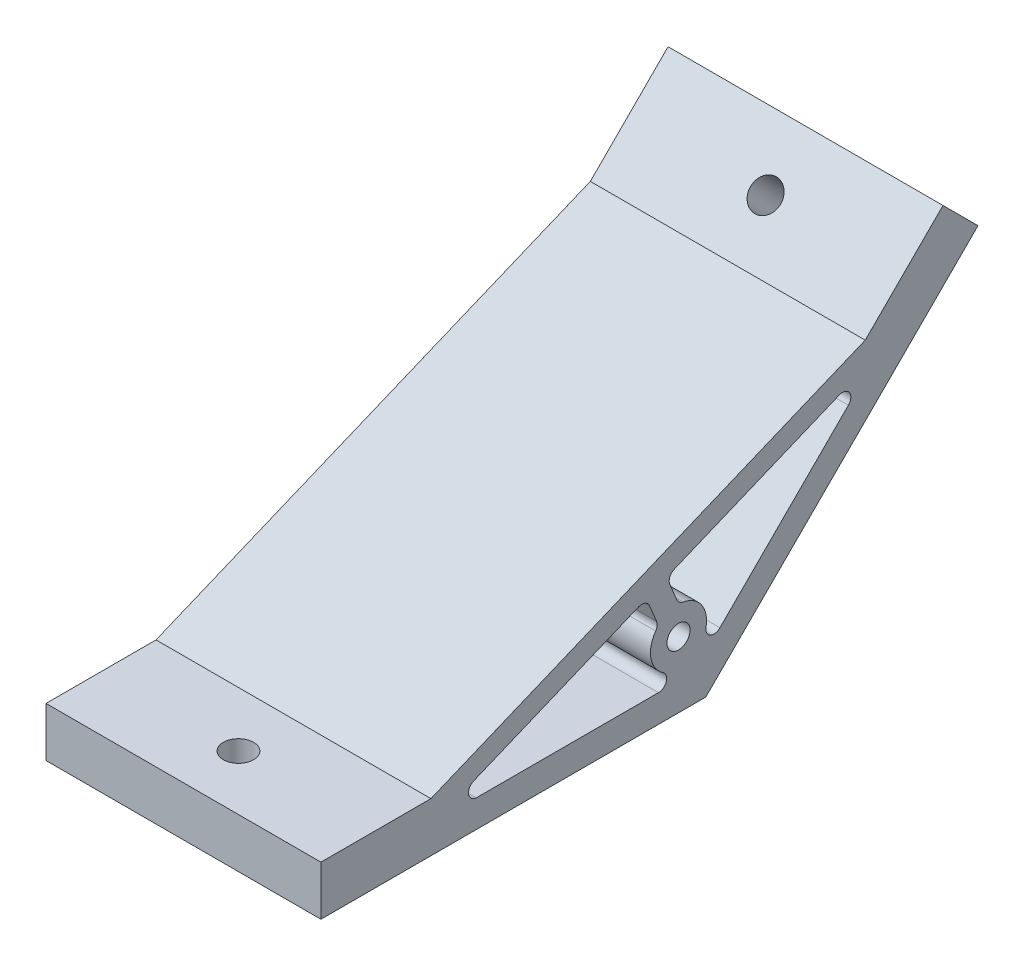
ISO-10303-21;
HEADER;
FILE_DESCRIPTION(('STEP AP214'),'2;1');
FILE_NAME('part.step','',(''),(''),'','','');
FILE_SCHEMA(('AUTOMOTIVE_DESIGN { 1 0 10303 214 1 1 1 1 }'));
ENDSEC;
DATA;
#1=APPLICATION_CONTEXT('core data for automotive mechanical design processes');
#2=APPLICATION_PROTOCOL_DEFINITION('international standard','automotive_design',2000,#1);
#3=PRODUCT_CONTEXT('',#1,'mechanical');
#4=PRODUCT('Part','Part','',(#3));
#5=PRODUCT_RELATED_PRODUCT_CATEGORY('part','',(#4));
#6=PRODUCT_DEFINITION_FORMATION('','',#4);
#7=PRODUCT_DEFINITION_CONTEXT('part definition',#1,'design');
#8=PRODUCT_DEFINITION('design','',#6,#7);
#9=PRODUCT_DEFINITION_SHAPE('','',#8);
#10=(LENGTH_UNIT() NAMED_UNIT(*) SI_UNIT(.MILLI.,.METRE.));
#11=(NAMED_UNIT(*) PLANE_ANGLE_UNIT() SI_UNIT($,.RADIAN.));
#12=(NAMED_UNIT(*) SI_UNIT($,.STERADIAN.) SOLID_ANGLE_UNIT());
#13=UNCERTAINTY_MEASURE_WITH_UNIT(LENGTH_MEASURE(1.E-05),#10,'distance_accuracy_value','');
#14=(GEOMETRIC_REPRESENTATION_CONTEXT(3) GLOBAL_UNCERTAINTY_ASSIGNED_CONTEXT((#13)) GLOBAL_UNIT_ASSIGNED_CONTEXT((#10,
#11,#12)) REPRESENTATION_CONTEXT('',''));
#15=CARTESIAN_POINT('',(0.,0.,0.));
#16=DIRECTION('',(0.,0.,1.));
#17=DIRECTION('',(1.,0.,0.));
#18=AXIS2_PLACEMENT_3D('',#15,#16,#17);
#19=CARTESIAN_POINT('',(32.,9.00000000000006,49.991379634898));
#20=DIRECTION('',(0.,-1.,0.));
#21=DIRECTION('',(0.,0.,-1.));
#22=AXIS2_PLACEMENT_3D('',#19,#20,#21);
#23=PLANE('',#22);
#24=CARTESIAN_POINT('',(7.,9.00000000000008,60.));
#25=DIRECTION('',(0.,-1.,0.));
#26=DIRECTION('',(0.,0.,-1.));
#27=AXIS2_PLACEMENT_3D('',#24,#25,#26);
#28=CIRCLE('',#27,2.74999999999998);
#29=CARTESIAN_POINT('',(7.,9.00000000000007,57.25));
#30=VERTEX_POINT('',#29);
#31=EDGE_CURVE('E683',#30,#30,#28,.T.);
#32=ORIENTED_EDGE('',*,*,#31,.T.);
#33=EDGE_LOOP('',(#32));
#34=FACE_BOUND('',#33,.T.);
#35=DIRECTION('',(-1.,0.,0.));
#36=VECTOR('',#35,1.);
#37=CARTESIAN_POINT('',(32.,9.00000000000006,49.991379634898));
#38=LINE('',#37,#36);
#39=CARTESIAN_POINT('',(32.,9.00000000000006,49.991379634898));
#40=VERTEX_POINT('',#39);
#41=CARTESIAN_POINT('',(-18.,9.00000000000006,49.991379634898));
#42=VERTEX_POINT('',#41);
#43=EDGE_CURVE('E324',#40,#42,#38,.T.);
#44=ORIENTED_EDGE('',*,*,#43,.T.);
#45=DIRECTION('',(0.,0.,1.));
#46=VECTOR('',#45,1.);
#47=CARTESIAN_POINT('',(-18.,9.00000000000006,49.991379634898));
#48=LINE('',#47,#46);
#49=CARTESIAN_POINT('',(-18.,9.0000000000001,70.));
#50=VERTEX_POINT('',#49);
#51=EDGE_CURVE('E282',#42,#50,#48,.T.);
#52=ORIENTED_EDGE('',*,*,#51,.T.);
#53=DIRECTION('',(-1.,0.,0.));
#54=VECTOR('',#53,1.);
#55=CARTESIAN_POINT('',(32.,9.0000000000001,70.));
#56=LINE('',#55,#54);
#57=CARTESIAN_POINT('',(32.,9.0000000000001,70.));
#58=VERTEX_POINT('',#57);
#59=EDGE_CURVE('E336',#58,#50,#56,.T.);
#60=ORIENTED_EDGE('',*,*,#59,.F.);
#61=DIRECTION('',(0.,0.,1.));
#62=VECTOR('',#61,1.);
#63=CARTESIAN_POINT('',(32.,9.00000000000006,49.991379634898));
#64=LINE('',#63,#62);
#65=EDGE_CURVE('E309',#40,#58,#64,.T.);
#66=ORIENTED_EDGE('',*,*,#65,.F.);
#67=EDGE_LOOP('',(#44,#52,#60,#66));
#68=FACE_BOUND('',#67,.T.);
#69=ADVANCED_FACE('F33',(#34,#68),#23,.F.);
#70=CARTESIAN_POINT('',(32.,9.0000000000001,70.));
#71=DIRECTION('',(0.,0.,-1.));
#72=DIRECTION('',(-1.,0.,0.));
#73=AXIS2_PLACEMENT_3D('',#70,#71,#72);
#74=PLANE('',#73);
#75=ORIENTED_EDGE('',*,*,#59,.T.);
#76=DIRECTION('',(0.,-1.,0.));
#77=VECTOR('',#76,1.);
#78=CARTESIAN_POINT('',(-18.,9.0000000000001,70.));
#79=LINE('',#78,#77);
#80=CARTESIAN_POINT('',(-18.,0.,70.));
#81=VERTEX_POINT('',#80);
#82=EDGE_CURVE('E291',#50,#81,#79,.T.);
#83=ORIENTED_EDGE('',*,*,#82,.T.);
#84=DIRECTION('',(-1.,0.,0.));
#85=VECTOR('',#84,1.);
#86=CARTESIAN_POINT('',(32.,0.,70.));
#87=LINE('',#86,#85);
#88=CARTESIAN_POINT('',(32.,0.,70.));
#89=VERTEX_POINT('',#88);
#90=EDGE_CURVE('E334',#89,#81,#87,.T.);
#91=ORIENTED_EDGE('',*,*,#90,.F.);
#92=DIRECTION('',(0.,-1.,0.));
#93=VECTOR('',#92,1.);
#94=CARTESIAN_POINT('',(32.,9.0000000000001,70.));
#95=LINE('',#94,#93);
#96=EDGE_CURVE('E312',#58,#89,#95,.T.);
#97=ORIENTED_EDGE('',*,*,#96,.F.);
#98=EDGE_LOOP('',(#75,#83,#91,#97));
#99=FACE_BOUND('',#98,.T.);
#100=ADVANCED_FACE('F420',(#99),#74,.F.);
#101=CARTESIAN_POINT('',(32.,0.,70.));
#102=DIRECTION('',(0.,1.,0.));
#103=DIRECTION('',(0.,0.,1.));
#104=AXIS2_PLACEMENT_3D('',#101,#102,#103);
#105=PLANE('',#104);
#106=CARTESIAN_POINT('',(7.,0.,60.));
#107=DIRECTION('',(0.,-1.,0.));
#108=DIRECTION('',(0.,0.,-1.));
#109=AXIS2_PLACEMENT_3D('',#106,#107,#108);
#110=CIRCLE('',#109,2.74999999999999);
#111=CARTESIAN_POINT('',(7.,0.,57.25));
#112=VERTEX_POINT('',#111);
#113=EDGE_CURVE('E660',#112,#112,#110,.T.);
#114=ORIENTED_EDGE('',*,*,#113,.F.);
#115=EDGE_LOOP('',(#114));
#116=FACE_BOUND('',#115,.T.);
#117=ORIENTED_EDGE('',*,*,#90,.T.);
#118=DIRECTION('',(0.,0.,-1.));
#119=VECTOR('',#118,1.);
#120=CARTESIAN_POINT('',(-18.,0.,70.));
#121=LINE('',#120,#119);
#122=CARTESIAN_POINT('',(-18.,0.,0.));
#123=VERTEX_POINT('',#122);
#124=EDGE_CURVE('E294',#81,#123,#121,.T.);
#125=ORIENTED_EDGE('',*,*,#124,.T.);
#126=DIRECTION('',(-1.,0.,0.));
#127=VECTOR('',#126,1.);
#128=CARTESIAN_POINT('',(32.,0.,0.));
#129=LINE('',#128,#127);
#130=CARTESIAN_POINT('',(32.,0.,0.));
#131=VERTEX_POINT('',#130);
#132=EDGE_CURVE('E332',#131,#123,#129,.T.);
#133=ORIENTED_EDGE('',*,*,#132,.F.);
#134=DIRECTION('',(0.,0.,-1.));
#135=VECTOR('',#134,1.);
#136=CARTESIAN_POINT('',(32.,0.,70.));
#137=LINE('',#136,#135);
#138=EDGE_CURVE('E314',#89,#131,#137,.T.);
#139=ORIENTED_EDGE('',*,*,#138,.F.);
#140=EDGE_LOOP('',(#117,#125,#133,#139));
#141=FACE_BOUND('',#140,.T.);
#142=ADVANCED_FACE('F426',(#116,#141),#105,.F.);
#143=CARTESIAN_POINT('',(32.,0.,0.));
#144=DIRECTION('',(0.,0.707106781186547,0.707106781186547));
#145=DIRECTION('',(0.,-0.707106781186548,0.707106781186548));
#146=AXIS2_PLACEMENT_3D('',#143,#144,#145);
#147=PLANE('',#146);
#148=CARTESIAN_POINT('',(7.,42.2357162228961,-42.2357162228961));
#149=DIRECTION('',(0.,-0.707106781186548,-0.707106781186547));
#150=DIRECTION('',(0.,0.707106781186547,-0.707106781186548));
#151=AXIS2_PLACEMENT_3D('',#148,#149,#150);
#152=CIRCLE('',#151,2.75);
#153=CARTESIAN_POINT('',(7.,44.1802598711591,-44.1802598711591));
#154=VERTEX_POINT('',#153);
#155=EDGE_CURVE('E219',#154,#154,#152,.T.);
#156=ORIENTED_EDGE('',*,*,#155,.F.);
#157=EDGE_LOOP('',(#156));
#158=FACE_BOUND('',#157,.T.);
#159=ORIENTED_EDGE('',*,*,#132,.T.);
#160=DIRECTION('',(0.,0.707106781186547,-0.707106781186547));
#161=VECTOR('',#160,1.);
#162=CARTESIAN_POINT('',(-18.,0.,0.));
#163=LINE('',#162,#161);
#164=CARTESIAN_POINT('',(-18.,49.497474683058,-49.497474683058));
#165=VERTEX_POINT('',#164);
#166=EDGE_CURVE('E297',#123,#165,#163,.T.);
#167=ORIENTED_EDGE('',*,*,#166,.T.);
#168=DIRECTION('',(-1.,0.,0.));
#169=VECTOR('',#168,1.);
#170=CARTESIAN_POINT('',(32.,49.497474683058,-49.497474683058));
#171=LINE('',#170,#169);
#172=CARTESIAN_POINT('',(32.,49.497474683058,-49.497474683058));
#173=VERTEX_POINT('',#172);
#174=EDGE_CURVE('E330',#173,#165,#171,.T.);
#175=ORIENTED_EDGE('',*,*,#174,.F.);
#176=DIRECTION('',(0.,0.707106781186547,-0.707106781186547));
#177=VECTOR('',#176,1.);
#178=CARTESIAN_POINT('',(32.,0.,0.));
#179=LINE('',#178,#177);
#180=EDGE_CURVE('E316',#131,#173,#179,.T.);
#181=ORIENTED_EDGE('',*,*,#180,.F.);
#182=EDGE_LOOP('',(#159,#167,#175,#181));
#183=FACE_BOUND('',#182,.T.);
#184=ADVANCED_FACE('F572',(#158,#183),#147,.F.);
#185=CARTESIAN_POINT('',(32.,49.497474683058,-49.497474683058));
#186=DIRECTION('',(0.,-0.707106781186549,0.707106781186546));
#187=DIRECTION('',(0.,-0.707106781186546,-0.707106781186549));
#188=AXIS2_PLACEMENT_3D('',#185,#186,#187);
#189=PLANE('',#188);
#190=ORIENTED_EDGE('',*,*,#174,.T.);
#191=DIRECTION('',(0.,0.707106781186546,0.707106781186549));
#192=VECTOR('',#191,1.);
#193=CARTESIAN_POINT('',(-18.,49.497474683058,-49.497474683058));
#194=LINE('',#193,#192);
#195=CARTESIAN_POINT('',(-18.,55.861435713737,-43.133513652379));
#196=VERTEX_POINT('',#195);
#197=EDGE_CURVE('E300',#165,#196,#194,.T.);
#198=ORIENTED_EDGE('',*,*,#197,.T.);
#199=DIRECTION('',(-1.,0.,0.));
#200=VECTOR('',#199,1.);
#201=CARTESIAN_POINT('',(32.,55.861435713737,-43.133513652379));
#202=LINE('',#201,#200);
#203=CARTESIAN_POINT('',(32.,55.861435713737,-43.133513652379));
#204=VERTEX_POINT('',#203);
#205=EDGE_CURVE('E328',#204,#196,#202,.T.);
#206=ORIENTED_EDGE('',*,*,#205,.F.);
#207=DIRECTION('',(0.,0.707106781186546,0.707106781186549));
#208=VECTOR('',#207,1.);
#209=CARTESIAN_POINT('',(32.,49.497474683058,-49.497474683058));
#210=LINE('',#209,#208);
#211=EDGE_CURVE('E318',#173,#204,#210,.T.);
#212=ORIENTED_EDGE('',*,*,#211,.F.);
#213=EDGE_LOOP('',(#190,#198,#206,#212));
#214=FACE_BOUND('',#213,.T.);
#215=ADVANCED_FACE('F576',(#214),#189,.F.);
#216=CARTESIAN_POINT('',(32.,55.861435713737,-43.133513652379));
#217=DIRECTION('',(0.,-0.707106781186523,-0.707106781186572));
#218=DIRECTION('',(0.,0.707106781186572,-0.707106781186523));
#219=AXIS2_PLACEMENT_3D('',#216,#217,#218);
#220=PLANE('',#219);
#221=CARTESIAN_POINT('',(7.,48.5996772535748,-35.8717551922173));
#222=DIRECTION('',(0.,-0.707106781186523,-0.707106781186572));
#223=DIRECTION('',(0.,0.707106781186572,-0.707106781186523));
#224=AXIS2_PLACEMENT_3D('',#221,#222,#223);
#225=CIRCLE('',#224,2.74999999999999);
#226=CARTESIAN_POINT('',(7.,50.5442209018379,-37.8162988404802));
#227=VERTEX_POINT('',#226);
#228=EDGE_CURVE('E231',#227,#227,#225,.T.);
#229=ORIENTED_EDGE('',*,*,#228,.T.);
#230=EDGE_LOOP('',(#229));
#231=FACE_BOUND('',#230,.T.);
#232=ORIENTED_EDGE('',*,*,#205,.T.);
#233=DIRECTION('',(0.,-0.707106781186572,0.707106781186523));
#234=VECTOR('',#233,1.);
#235=CARTESIAN_POINT('',(-18.,55.861435713737,-43.133513652379));
#236=LINE('',#235,#234);
#237=CARTESIAN_POINT('',(-18.,41.719300090006,-28.991378028649));
#238=VERTEX_POINT('',#237);
#239=EDGE_CURVE('E303',#196,#238,#236,.T.);
#240=ORIENTED_EDGE('',*,*,#239,.T.);
#241=DIRECTION('',(-1.,0.,0.));
#242=VECTOR('',#241,1.);
#243=CARTESIAN_POINT('',(32.,41.719300090006,-28.991378028649));
#244=LINE('',#243,#242);
#245=CARTESIAN_POINT('',(32.,41.719300090006,-28.991378028649));
#246=VERTEX_POINT('',#245);
#247=EDGE_CURVE('E326',#246,#238,#244,.T.);
#248=ORIENTED_EDGE('',*,*,#247,.F.);
#249=DIRECTION('',(0.,-0.707106781186572,0.707106781186523));
#250=VECTOR('',#249,1.);
#251=CARTESIAN_POINT('',(32.,55.861435713737,-43.133513652379));
#252=LINE('',#251,#250);
#253=EDGE_CURVE('E320',#204,#246,#252,.T.);
#254=ORIENTED_EDGE('',*,*,#253,.F.);
#255=EDGE_LOOP('',(#232,#240,#248,#254));
#256=FACE_BOUND('',#255,.T.);
#257=ADVANCED_FACE('F586',(#231,#256),#220,.F.);
#258=CARTESIAN_POINT('',(32.,41.719300090006,-28.991378028649));
#259=DIRECTION('',(0.,-0.923864765203705,-0.382719081853914));
#260=DIRECTION('',(0.,0.382719081853914,-0.923864765203705));
#261=AXIS2_PLACEMENT_3D('',#258,#259,#260);
#262=PLANE('',#261);
#263=ORIENTED_EDGE('',*,*,#247,.T.);
#264=DIRECTION('',(0.,-0.382719081853914,0.923864765203705));
#265=VECTOR('',#264,1.);
#266=CARTESIAN_POINT('',(-18.,41.719300090006,-28.991378028649));
#267=LINE('',#266,#265);
#268=EDGE_CURVE('E306',#238,#42,#267,.T.);
#269=ORIENTED_EDGE('',*,*,#268,.T.);
#270=ORIENTED_EDGE('',*,*,#43,.F.);
#271=DIRECTION('',(0.,-0.382719081853914,0.923864765203705));
#272=VECTOR('',#271,1.);
#273=CARTESIAN_POINT('',(32.,41.719300090006,-28.991378028649));
#274=LINE('',#273,#272);
#275=EDGE_CURVE('E322',#246,#40,#274,.T.);
#276=ORIENTED_EDGE('',*,*,#275,.F.);
#277=EDGE_LOOP('',(#263,#269,#270,#276));
#278=FACE_BOUND('',#277,.T.);
#279=ADVANCED_FACE('F590',(#278),#262,.F.);
#280=CARTESIAN_POINT('',(32.,0.,0.));
#281=DIRECTION('',(1.,0.,0.));
#282=DIRECTION('',(0.,0.,-1.));
#283=AXIS2_PLACEMENT_3D('',#280,#281,#282);
#284=PLANE('',#283);
#285=CARTESIAN_POINT('',(32.,12.,4.9705627484771));
#286=DIRECTION('',(-1.,0.,0.));
#287=DIRECTION('',(0.,0.,1.));
#288=AXIS2_PLACEMENT_3D('',#285,#286,#287);
#289=CIRCLE('',#288,2.09999999999999);
#290=CARTESIAN_POINT('',(32.,12.,7.07056274847709));
#291=VERTEX_POINT('',#290);
#292=EDGE_CURVE('E684',#291,#291,#289,.T.);
#293=ORIENTED_EDGE('',*,*,#292,.T.);
#294=EDGE_LOOP('',(#293));
#295=FACE_BOUND('',#294,.T.);
#296=CARTESIAN_POINT('',(32.,34.0566252323827,-24.8642370769577));
#297=DIRECTION('',(-1.,0.,0.));
#298=DIRECTION('',(0.,0.,1.));
#299=AXIS2_PLACEMENT_3D('',#296,#297,#298);
#300=CIRCLE('',#299,1.5);
#301=CARTESIAN_POINT('',(32.,35.4424445311496,-24.2902119284101));
#302=VERTEX_POINT('',#301);
#303=CARTESIAN_POINT('',(32.,32.9959650606027,-25.9248972487373));
#304=VERTEX_POINT('',#303);
#305=EDGE_CURVE('E193',#302,#304,#300,.T.);
#306=ORIENTED_EDGE('',*,*,#305,.T.);
#307=DIRECTION('',(0.,-0.707106781186548,0.707106781186547));
#308=VECTOR('',#307,1.);
#309=CARTESIAN_POINT('',(32.,32.9959650606027,-25.9248972487373));
#310=LINE('',#309,#308);
#311=CARTESIAN_POINT('',(32.,9.62998119959845,-2.55891338773311));
#312=VERTEX_POINT('',#311);
#313=EDGE_CURVE('E204',#304,#312,#310,.T.);
#314=ORIENTED_EDGE('',*,*,#313,.T.);
#315=CARTESIAN_POINT('',(32.,10.6906413713782,-1.49825321595333));
#316=DIRECTION('',(-1.,0.,0.));
#317=DIRECTION('',(0.,0.,1.));
#318=AXIS2_PLACEMENT_3D('',#315,#316,#317);
#319=CIRCLE('',#318,1.49999999999994);
#320=CARTESIAN_POINT('',(32.,10.9882228778834,-0.0280677694921459));
#321=VERTEX_POINT('',#320);
#322=EDGE_CURVE('E208',#312,#321,#319,.T.);
#323=ORIENTED_EDGE('',*,*,#322,.T.);
#324=CARTESIAN_POINT('',(32.,12.0000000000009,4.9705627484758));
#325=DIRECTION('',(1.,0.,0.));
#326=DIRECTION('',(0.,0.,-1.));
#327=AXIS2_PLACEMENT_3D('',#324,#325,#326);
#328=CIRCLE('',#327,5.10000000000009);
#329=CARTESIAN_POINT('',(32.,17.0296750860536,4.12654347811406));
#330=VERTEX_POINT('',#329);
#331=EDGE_CURVE('E223',#321,#330,#328,.T.);
#332=ORIENTED_EDGE('',*,*,#331,.T.);
#333=CARTESIAN_POINT('',(32.,18.5089912878337,3.87830251624297));
#334=DIRECTION('',(1.,0.,0.));
#335=DIRECTION('',(0.,0.,-1.));
#336=AXIS2_PLACEMENT_3D('',#333,#334,#335);
#337=CIRCLE('',#336,1.5);
#338=CARTESIAN_POINT('',(32.,17.9349661392861,5.26412181500991));
#339=VERTEX_POINT('',#338);
#340=EDGE_CURVE('E11',#330,#339,#337,.F.);
#341=ORIENTED_EDGE('',*,*,#340,.T.);
#342=DIRECTION('',(0.,0.923879532511294,0.382683432365072));
#343=VECTOR('',#342,1.);
#344=CARTESIAN_POINT('',(32.,17.0997307312008,4.91815598120674));
#345=LINE('',#344,#343);
#346=CARTESIAN_POINT('',(32.,21.043679480922,6.55179304264558));
#347=VERTEX_POINT('',#346);
#348=EDGE_CURVE('E225',#339,#347,#345,.T.);
#349=ORIENTED_EDGE('',*,*,#348,.T.);
#350=CARTESIAN_POINT('',(32.,21.6177046294696,5.16597374387864));
#351=DIRECTION('',(1.,0.,0.));
#352=DIRECTION('',(0.,0.,-1.));
#353=AXIS2_PLACEMENT_3D('',#350,#351,#352);
#354=CIRCLE('',#353,1.5);
#355=CARTESIAN_POINT('',(32.,23.0035239282365,5.73999889242626));
#356=VERTEX_POINT('',#355);
#357=EDGE_CURVE('E365',#347,#356,#354,.F.);
#358=ORIENTED_EDGE('',*,*,#357,.T.);
#359=DIRECTION('',(0.,0.382683432365075,-0.923879532511293));
#360=VECTOR('',#359,1.);
#361=CARTESIAN_POINT('',(32.,22.4294987796889,7.12581819119319));
#362=LINE('',#361,#360);
#363=EDGE_CURVE('E200',#356,#302,#362,.T.);
#364=ORIENTED_EDGE('',*,*,#363,.T.);
#365=EDGE_LOOP('',(#306,#314,#323,#332,#341,#349,#358,#364));
#366=FACE_BOUND('',#365,.T.);
#367=CARTESIAN_POINT('',(32.,6.49999999894205,41.6633412751829));
#368=DIRECTION('',(1.,0.,0.));
#369=DIRECTION('',(0.,0.,-1.));
#370=AXIS2_PLACEMENT_3D('',#367,#368,#369);
#371=CIRCLE('',#370,1.5);
#372=CARTESIAN_POINT('',(32.,7.88587678340003,42.2372276213355));
#373=VERTEX_POINT('',#372);
#374=CARTESIAN_POINT('',(32.,5.00286088113988,41.755939665809));
#375=VERTEX_POINT('',#374);
#376=EDGE_CURVE('E242',#373,#375,#371,.T.);
#377=ORIENTED_EDGE('',*,*,#376,.F.);
#378=DIRECTION('',(0.,-0.382590897435075,0.923917856305323));
#379=VECTOR('',#378,1.);
#380=CARTESIAN_POINT('',(32.,20.8956185146032,10.8200329835072));
#381=LINE('',#380,#379);
#382=CARTESIAN_POINT('',(32.,20.3217321684506,12.2059097679651));
#383=VERTEX_POINT('',#382);
#384=EDGE_CURVE('E250',#383,#373,#381,.T.);
#385=ORIENTED_EDGE('',*,*,#384,.F.);
#386=CARTESIAN_POINT('',(32.,18.9358553839926,11.6320234218125));
#387=DIRECTION('',(1.,0.,0.));
#388=DIRECTION('',(0.,0.,-1.));
#389=AXIS2_PLACEMENT_3D('',#386,#387,#388);
#390=CIRCLE('',#389,1.5);
#391=CARTESIAN_POINT('',(32.,19.5097417301453,10.2461466373545));
#392=VERTEX_POINT('',#391);
#393=EDGE_CURVE('E367',#383,#392,#390,.F.);
#394=ORIENTED_EDGE('',*,*,#393,.T.);
#395=DIRECTION('',(0.,0.923917856305323,0.382590897435075));
#396=VECTOR('',#395,1.);
#397=CARTESIAN_POINT('',(32.,15.5687715740991,8.61420576893573));
#398=LINE('',#397,#396);
#399=CARTESIAN_POINT('',(32.,16.4038769660129,8.96001976004406));
#400=VERTEX_POINT('',#399);
#401=EDGE_CURVE('E275',#400,#392,#398,.T.);
#402=ORIENTED_EDGE('',*,*,#401,.F.);
#403=CARTESIAN_POINT('',(32.,15.8299906198603,10.345896544502));
#404=DIRECTION('',(1.,0.,0.));
#405=DIRECTION('',(0.,0.,-1.));
#406=AXIS2_PLACEMENT_3D('',#403,#404,#405);
#407=CIRCLE('',#406,1.5);
#408=CARTESIAN_POINT('',(32.,14.9595619603777,9.12427714847427));
#409=VERTEX_POINT('',#408);
#410=EDGE_CURVE('E359',#400,#409,#407,.F.);
#411=ORIENTED_EDGE('',*,*,#410,.T.);
#412=CARTESIAN_POINT('',(32.,12.0001045181367,4.97077120197969));
#413=DIRECTION('',(-1.,0.,0.));
#414=DIRECTION('',(0.,0.,1.));
#415=AXIS2_PLACEMENT_3D('',#412,#413,#414);
#416=CIRCLE('',#415,5.10000000000017);
#417=CARTESIAN_POINT('',(32.,7.75636405280584,7.79931621009173));
#418=VERTEX_POINT('',#417);
#419=EDGE_CURVE('E272',#418,#409,#416,.T.);
#420=ORIENTED_EDGE('',*,*,#419,.F.);
#421=CARTESIAN_POINT('',(32.,6.50000000104492,8.61879736877869));
#422=DIRECTION('',(1.,0.,0.));
#423=DIRECTION('',(0.,0.,-1.));
#424=AXIS2_PLACEMENT_3D('',#421,#422,#423);
#425=CIRCLE('',#424,1.50000000000002);
#426=CARTESIAN_POINT('',(32.,5.00000000663516,8.61892687084841));
#427=VERTEX_POINT('',#426);
#428=EDGE_CURVE('E269',#427,#418,#425,.T.);
#429=ORIENTED_EDGE('',*,*,#428,.F.);
#430=DIRECTION('',(0.,-8.63347131428251E-05,-0.999999996273159));
#431=VECTOR('',#430,1.);
#432=CARTESIAN_POINT('',(32.,5.00286088113988,41.755939665809));
#433=LINE('',#432,#431);
#434=EDGE_CURVE('E266',#375,#427,#433,.T.);
#435=ORIENTED_EDGE('',*,*,#434,.F.);
#436=EDGE_LOOP('',(#377,#385,#394,#402,#411,#420,#429,#435));
#437=FACE_BOUND('',#436,.T.);
#438=ORIENTED_EDGE('',*,*,#65,.T.);
#439=ORIENTED_EDGE('',*,*,#96,.T.);
#440=ORIENTED_EDGE('',*,*,#138,.T.);
#441=ORIENTED_EDGE('',*,*,#180,.T.);
#442=ORIENTED_EDGE('',*,*,#211,.T.);
#443=ORIENTED_EDGE('',*,*,#253,.T.);
#444=ORIENTED_EDGE('',*,*,#275,.T.);
#445=EDGE_LOOP('',(#438,#439,#440,#441,#442,#443,#444));
#446=FACE_BOUND('',#445,.T.);
#447=ADVANCED_FACE('F210',(#295,#366,#437,#446),#284,.T.);
#448=CARTESIAN_POINT('',(-18.,0.,0.));
#449=DIRECTION('',(1.,0.,0.));
#450=DIRECTION('',(0.,0.,-1.));
#451=AXIS2_PLACEMENT_3D('',#448,#449,#450);
#452=PLANE('',#451);
#453=CARTESIAN_POINT('',(-18.,12.,4.9705627484771));
#454=DIRECTION('',(-1.,0.,0.));
#455=DIRECTION('',(0.,0.,1.));
#456=AXIS2_PLACEMENT_3D('',#453,#454,#455);
#457=CIRCLE('',#456,2.09999999999999);
#458=CARTESIAN_POINT('',(-18.,12.,7.07056274847709));
#459=VERTEX_POINT('',#458);
#460=EDGE_CURVE('E686',#459,#459,#457,.T.);
#461=ORIENTED_EDGE('',*,*,#460,.F.);
#462=EDGE_LOOP('',(#461));
#463=FACE_BOUND('',#462,.T.);
#464=DIRECTION('',(0.,-0.707106781186548,0.707106781186547));
#465=VECTOR('',#464,1.);
#466=CARTESIAN_POINT('',(-18.,32.9959650606027,-25.9248972487373));
#467=LINE('',#466,#465);
#468=CARTESIAN_POINT('',(-18.,32.9959650606027,-25.9248972487373));
#469=VERTEX_POINT('',#468);
#470=CARTESIAN_POINT('',(-18.,9.62998119959842,-2.55891338773311));
#471=VERTEX_POINT('',#470);
#472=EDGE_CURVE('E230',#469,#471,#467,.T.);
#473=ORIENTED_EDGE('',*,*,#472,.F.);
#474=CARTESIAN_POINT('',(-18.,34.0566252323827,-24.8642370769577));
#475=DIRECTION('',(-1.,0.,0.));
#476=DIRECTION('',(0.,0.,1.));
#477=AXIS2_PLACEMENT_3D('',#474,#475,#476);
#478=CIRCLE('',#477,1.5);
#479=CARTESIAN_POINT('',(-18.,35.4424445311496,-24.2902119284101));
#480=VERTEX_POINT('',#479);
#481=EDGE_CURVE('E195',#480,#469,#478,.T.);
#482=ORIENTED_EDGE('',*,*,#481,.F.);
#483=DIRECTION('',(0.,0.382683432365075,-0.923879532511293));
#484=VECTOR('',#483,1.);
#485=CARTESIAN_POINT('',(-18.,22.4294987796889,7.12581819119319));
#486=LINE('',#485,#484);
#487=CARTESIAN_POINT('',(-18.,23.0035239282365,5.73999889242626));
#488=VERTEX_POINT('',#487);
#489=EDGE_CURVE('E214',#488,#480,#486,.T.);
#490=ORIENTED_EDGE('',*,*,#489,.F.);
#491=CARTESIAN_POINT('',(-18.,21.6177046294696,5.16597374387864));
#492=DIRECTION('',(1.,0.,0.));
#493=DIRECTION('',(0.,0.,-1.));
#494=AXIS2_PLACEMENT_3D('',#491,#492,#493);
#495=CIRCLE('',#494,1.5);
#496=CARTESIAN_POINT('',(-18.,21.043679480922,6.55179304264558));
#497=VERTEX_POINT('',#496);
#498=EDGE_CURVE('E363',#488,#497,#495,.T.);
#499=ORIENTED_EDGE('',*,*,#498,.T.);
#500=DIRECTION('',(0.,0.923879532511294,0.382683432365072));
#501=VECTOR('',#500,1.);
#502=CARTESIAN_POINT('',(-18.,17.0997307312008,4.91815598120674));
#503=LINE('',#502,#501);
#504=CARTESIAN_POINT('',(-18.,17.9349661392861,5.26412181500991));
#505=VERTEX_POINT('',#504);
#506=EDGE_CURVE('E216',#505,#497,#503,.T.);
#507=ORIENTED_EDGE('',*,*,#506,.F.);
#508=CARTESIAN_POINT('',(-18.,18.5089912878337,3.87830251624297));
#509=DIRECTION('',(1.,0.,0.));
#510=DIRECTION('',(0.,0.,-1.));
#511=AXIS2_PLACEMENT_3D('',#508,#509,#510);
#512=CIRCLE('',#511,1.5);
#513=CARTESIAN_POINT('',(-18.,17.0296750860536,4.12654347811406));
#514=VERTEX_POINT('',#513);
#515=EDGE_CURVE('E41',#505,#514,#512,.T.);
#516=ORIENTED_EDGE('',*,*,#515,.T.);
#517=CARTESIAN_POINT('',(-18.,12.0000000000009,4.9705627484758));
#518=DIRECTION('',(1.,0.,0.));
#519=DIRECTION('',(0.,0.,-1.));
#520=AXIS2_PLACEMENT_3D('',#517,#518,#519);
#521=CIRCLE('',#520,5.10000000000009);
#522=CARTESIAN_POINT('',(-18.,10.9882228778834,-0.0280677694921459));
#523=VERTEX_POINT('',#522);
#524=EDGE_CURVE('E236',#523,#514,#521,.T.);
#525=ORIENTED_EDGE('',*,*,#524,.F.);
#526=CARTESIAN_POINT('',(-18.,10.6906413713782,-1.49825321595333));
#527=DIRECTION('',(-1.,0.,0.));
#528=DIRECTION('',(0.,0.,1.));
#529=AXIS2_PLACEMENT_3D('',#526,#527,#528);
#530=CIRCLE('',#529,1.49999999999994);
#531=EDGE_CURVE('E233',#471,#523,#530,.T.);
#532=ORIENTED_EDGE('',*,*,#531,.F.);
#533=EDGE_LOOP('',(#473,#482,#490,#499,#507,#516,#525,#532));
#534=FACE_BOUND('',#533,.T.);
#535=DIRECTION('',(0.,0.923917856305323,0.382590897435075));
#536=VECTOR('',#535,1.);
#537=CARTESIAN_POINT('',(-18.,15.5687715740991,8.61420576893573));
#538=LINE('',#537,#536);
#539=CARTESIAN_POINT('',(-18.,16.4038769660129,8.96001976004406));
#540=VERTEX_POINT('',#539);
#541=CARTESIAN_POINT('',(-18.,19.5097417301453,10.2461466373545));
#542=VERTEX_POINT('',#541);
#543=EDGE_CURVE('E259',#540,#542,#538,.T.);
#544=ORIENTED_EDGE('',*,*,#543,.T.);
#545=CARTESIAN_POINT('',(-18.,18.9358553839926,11.6320234218125));
#546=DIRECTION('',(1.,0.,0.));
#547=DIRECTION('',(0.,0.,-1.));
#548=AXIS2_PLACEMENT_3D('',#545,#546,#547);
#549=CIRCLE('',#548,1.5);
#550=CARTESIAN_POINT('',(-18.,20.3217321684506,12.2059097679651));
#551=VERTEX_POINT('',#550);
#552=EDGE_CURVE('E369',#542,#551,#549,.T.);
#553=ORIENTED_EDGE('',*,*,#552,.T.);
#554=DIRECTION('',(0.,-0.382590897435075,0.923917856305323));
#555=VECTOR('',#554,1.);
#556=CARTESIAN_POINT('',(-18.,20.8956185146032,10.8200329835072));
#557=LINE('',#556,#555);
#558=CARTESIAN_POINT('',(-18.,7.88587678340003,42.2372276213355));
#559=VERTEX_POINT('',#558);
#560=EDGE_CURVE('E262',#551,#559,#557,.T.);
#561=ORIENTED_EDGE('',*,*,#560,.T.);
#562=CARTESIAN_POINT('',(-18.,6.49999999894205,41.6633412751829));
#563=DIRECTION('',(1.,0.,0.));
#564=DIRECTION('',(0.,0.,-1.));
#565=AXIS2_PLACEMENT_3D('',#562,#563,#564);
#566=CIRCLE('',#565,1.5);
#567=CARTESIAN_POINT('',(-18.,5.00286088113988,41.755939665809));
#568=VERTEX_POINT('',#567);
#569=EDGE_CURVE('E246',#559,#568,#566,.T.);
#570=ORIENTED_EDGE('',*,*,#569,.T.);
#571=DIRECTION('',(0.,-8.63347131428251E-05,-0.999999996273159));
#572=VECTOR('',#571,1.);
#573=CARTESIAN_POINT('',(-18.,5.00286088113988,41.755939665809));
#574=LINE('',#573,#572);
#575=CARTESIAN_POINT('',(-18.,5.00000000663516,8.61892687084841));
#576=VERTEX_POINT('',#575);
#577=EDGE_CURVE('E249',#568,#576,#574,.T.);
#578=ORIENTED_EDGE('',*,*,#577,.T.);
#579=CARTESIAN_POINT('',(-18.,6.50000000104492,8.61879736877869));
#580=DIRECTION('',(1.,0.,0.));
#581=DIRECTION('',(0.,0.,-1.));
#582=AXIS2_PLACEMENT_3D('',#579,#580,#581);
#583=CIRCLE('',#582,1.50000000000002);
#584=CARTESIAN_POINT('',(-18.,7.75636405280584,7.79931621009173));
#585=VERTEX_POINT('',#584);
#586=EDGE_CURVE('E253',#576,#585,#583,.T.);
#587=ORIENTED_EDGE('',*,*,#586,.T.);
#588=CARTESIAN_POINT('',(-18.,12.0001045181367,4.97077120197969));
#589=DIRECTION('',(-1.,0.,0.));
#590=DIRECTION('',(0.,0.,1.));
#591=AXIS2_PLACEMENT_3D('',#588,#589,#590);
#592=CIRCLE('',#591,5.10000000000017);
#593=CARTESIAN_POINT('',(-18.,14.9595619603777,9.12427714847427));
#594=VERTEX_POINT('',#593);
#595=EDGE_CURVE('E256',#585,#594,#592,.T.);
#596=ORIENTED_EDGE('',*,*,#595,.T.);
#597=CARTESIAN_POINT('',(-18.,15.8299906198603,10.345896544502));
#598=DIRECTION('',(1.,0.,0.));
#599=DIRECTION('',(0.,0.,-1.));
#600=AXIS2_PLACEMENT_3D('',#597,#598,#599);
#601=CIRCLE('',#600,1.5);
#602=EDGE_CURVE('E361',#594,#540,#601,.T.);
#603=ORIENTED_EDGE('',*,*,#602,.T.);
#604=EDGE_LOOP('',(#544,#553,#561,#570,#578,#587,#596,#603));
#605=FACE_BOUND('',#604,.T.);
#606=ORIENTED_EDGE('',*,*,#51,.F.);
#607=ORIENTED_EDGE('',*,*,#268,.F.);
#608=ORIENTED_EDGE('',*,*,#239,.F.);
#609=ORIENTED_EDGE('',*,*,#197,.F.);
#610=ORIENTED_EDGE('',*,*,#166,.F.);
#611=ORIENTED_EDGE('',*,*,#124,.F.);
#612=ORIENTED_EDGE('',*,*,#82,.F.);
#613=EDGE_LOOP('',(#606,#607,#608,#609,#610,#611,#612));
#614=FACE_BOUND('',#613,.T.);
#615=ADVANCED_FACE('F373',(#463,#534,#605,#614),#452,.F.);
#616=CARTESIAN_POINT('',(-18.,6.49999999894205,41.6633412751829));
#617=DIRECTION('',(1.,0.,0.));
#618=DIRECTION('',(0.,0.,-1.));
#619=AXIS2_PLACEMENT_3D('',#616,#617,#618);
#620=CYLINDRICAL_SURFACE('',#619,1.5);
#621=ORIENTED_EDGE('',*,*,#376,.T.);
#622=DIRECTION('',(1.,0.,0.));
#623=VECTOR('',#622,1.);
#624=CARTESIAN_POINT('',(-18.,5.00286088113988,41.755939665809));
#625=LINE('',#624,#623);
#626=EDGE_CURVE('E264',#568,#375,#625,.T.);
#627=ORIENTED_EDGE('',*,*,#626,.F.);
#628=ORIENTED_EDGE('',*,*,#569,.F.);
#629=DIRECTION('',(1.,0.,0.));
#630=VECTOR('',#629,1.);
#631=CARTESIAN_POINT('',(-18.,7.88587678340003,42.2372276213355));
#632=LINE('',#631,#630);
#633=EDGE_CURVE('E279',#559,#373,#632,.T.);
#634=ORIENTED_EDGE('',*,*,#633,.T.);
#635=EDGE_LOOP('',(#621,#627,#628,#634));
#636=FACE_BOUND('',#635,.T.);
#637=ADVANCED_FACE('F408',(#636),#620,.F.);
#638=CARTESIAN_POINT('',(-18.,20.8956185146032,10.8200329835072));
#639=DIRECTION('',(0.,0.923917856305323,0.382590897435075));
#640=DIRECTION('',(0.,-0.382590897435075,0.923917856305323));
#641=AXIS2_PLACEMENT_3D('',#638,#639,#640);
#642=PLANE('',#641);
#643=ORIENTED_EDGE('',*,*,#560,.F.);
#644=DIRECTION('',(1.,0.,0.));
#645=VECTOR('',#644,1.);
#646=CARTESIAN_POINT('',(32.,20.3217321684506,12.2059097679651));
#647=LINE('',#646,#645);
#648=EDGE_CURVE('E355',#551,#383,#647,.T.);
#649=ORIENTED_EDGE('',*,*,#648,.T.);
#650=ORIENTED_EDGE('',*,*,#384,.T.);
#651=ORIENTED_EDGE('',*,*,#633,.F.);
#652=EDGE_LOOP('',(#643,#649,#650,#651));
#653=FACE_BOUND('',#652,.T.);
#654=ADVANCED_FACE('F381',(#653),#642,.F.);
#655=CARTESIAN_POINT('',(-18.,15.5687715740991,8.61420576893573));
#656=DIRECTION('',(0.,0.382590897435075,-0.923917856305323));
#657=DIRECTION('',(0.,0.923917856305323,0.382590897435075));
#658=AXIS2_PLACEMENT_3D('',#655,#656,#657);
#659=PLANE('',#658);
#660=ORIENTED_EDGE('',*,*,#543,.F.);
#661=DIRECTION('',(-1.,0.,0.));
#662=VECTOR('',#661,1.);
#663=CARTESIAN_POINT('',(32.,16.4038769660129,8.96001976004406));
#664=LINE('',#663,#662);
#665=EDGE_CURVE('E342',#540,#400,#664,.F.);
#666=ORIENTED_EDGE('',*,*,#665,.T.);
#667=ORIENTED_EDGE('',*,*,#401,.T.);
#668=DIRECTION('',(1.,0.,0.));
#669=VECTOR('',#668,1.);
#670=CARTESIAN_POINT('',(-18.,19.5097417301453,10.2461466373545));
#671=LINE('',#670,#669);
#672=EDGE_CURVE('E338',#392,#542,#671,.F.);
#673=ORIENTED_EDGE('',*,*,#672,.T.);
#674=EDGE_LOOP('',(#660,#666,#667,#673));
#675=FACE_BOUND('',#674,.T.);
#676=ADVANCED_FACE('F389',(#675),#659,.F.);
#677=CARTESIAN_POINT('',(-18.,12.0001045181367,4.97077120197969));
#678=DIRECTION('',(1.,0.,0.));
#679=DIRECTION('',(0.,0.,-1.));
#680=AXIS2_PLACEMENT_3D('',#677,#678,#679);
#681=CYLINDRICAL_SURFACE('',#680,5.10000000000017);
#682=ORIENTED_EDGE('',*,*,#419,.T.);
#683=DIRECTION('',(1.,0.,0.));
#684=VECTOR('',#683,1.);
#685=CARTESIAN_POINT('',(-18.,14.9595619603777,9.12427714847427));
#686=LINE('',#685,#684);
#687=EDGE_CURVE('E345',#409,#594,#686,.F.);
#688=ORIENTED_EDGE('',*,*,#687,.T.);
#689=ORIENTED_EDGE('',*,*,#595,.F.);
#690=DIRECTION('',(1.,0.,0.));
#691=VECTOR('',#690,1.);
#692=CARTESIAN_POINT('',(-18.,7.75636405280584,7.79931621009173));
#693=LINE('',#692,#691);
#694=EDGE_CURVE('E283',#585,#418,#693,.T.);
#695=ORIENTED_EDGE('',*,*,#694,.T.);
#696=EDGE_LOOP('',(#682,#688,#689,#695));
#697=FACE_BOUND('',#696,.T.);
#698=ADVANCED_FACE('F398',(#697),#681,.T.);
#699=CARTESIAN_POINT('',(-18.,6.50000000104492,8.61879736877869));
#700=DIRECTION('',(1.,0.,0.));
#701=DIRECTION('',(0.,0.,-1.));
#702=AXIS2_PLACEMENT_3D('',#699,#700,#701);
#703=CYLINDRICAL_SURFACE('',#702,1.50000000000002);
#704=ORIENTED_EDGE('',*,*,#428,.T.);
#705=ORIENTED_EDGE('',*,*,#694,.F.);
#706=ORIENTED_EDGE('',*,*,#586,.F.);
#707=DIRECTION('',(1.,0.,0.));
#708=VECTOR('',#707,1.);
#709=CARTESIAN_POINT('',(-18.,5.00000000663516,8.61892687084841));
#710=LINE('',#709,#708);
#711=EDGE_CURVE('E285',#576,#427,#710,.T.);
#712=ORIENTED_EDGE('',*,*,#711,.T.);
#713=EDGE_LOOP('',(#704,#705,#706,#712));
#714=FACE_BOUND('',#713,.T.);
#715=ADVANCED_FACE('F401',(#714),#703,.F.);
#716=CARTESIAN_POINT('',(-18.,5.00286088113988,41.755939665809));
#717=DIRECTION('',(0.,-0.999999996273159,8.63347131428251E-05));
#718=DIRECTION('',(0.,-8.63347131428251E-05,-0.999999996273159));
#719=AXIS2_PLACEMENT_3D('',#716,#717,#718);
#720=PLANE('',#719);
#721=ORIENTED_EDGE('',*,*,#434,.T.);
#722=ORIENTED_EDGE('',*,*,#711,.F.);
#723=ORIENTED_EDGE('',*,*,#577,.F.);
#724=ORIENTED_EDGE('',*,*,#626,.T.);
#725=EDGE_LOOP('',(#721,#722,#723,#724));
#726=FACE_BOUND('',#725,.T.);
#727=ADVANCED_FACE('F405',(#726),#720,.F.);
#728=CARTESIAN_POINT('',(32.,34.0566252323827,-24.8642370769577));
#729=DIRECTION('',(-1.,0.,0.));
#730=DIRECTION('',(0.,0.,1.));
#731=AXIS2_PLACEMENT_3D('',#728,#729,#730);
#732=CYLINDRICAL_SURFACE('',#731,1.5);
#733=ORIENTED_EDGE('',*,*,#481,.T.);
#734=DIRECTION('',(-1.,0.,0.));
#735=VECTOR('',#734,1.);
#736=CARTESIAN_POINT('',(32.,32.9959650606027,-25.9248972487373));
#737=LINE('',#736,#735);
#738=EDGE_CURVE('E188',#304,#469,#737,.T.);
#739=ORIENTED_EDGE('',*,*,#738,.F.);
#740=ORIENTED_EDGE('',*,*,#305,.F.);
#741=DIRECTION('',(-1.,0.,0.));
#742=VECTOR('',#741,1.);
#743=CARTESIAN_POINT('',(32.,35.4424445311496,-24.2902119284101));
#744=LINE('',#743,#742);
#745=EDGE_CURVE('E240',#302,#480,#744,.T.);
#746=ORIENTED_EDGE('',*,*,#745,.T.);
#747=EDGE_LOOP('',(#733,#739,#740,#746));
#748=FACE_BOUND('',#747,.T.);
#749=ADVANCED_FACE('F190',(#748),#732,.F.);
#750=CARTESIAN_POINT('',(32.,22.4294987796889,7.12581819119319));
#751=DIRECTION('',(0.,0.923879532511293,0.382683432365075));
#752=DIRECTION('',(0.,-0.382683432365075,0.923879532511293));
#753=AXIS2_PLACEMENT_3D('',#750,#751,#752);
#754=PLANE('',#753);
#755=ORIENTED_EDGE('',*,*,#363,.F.);
#756=DIRECTION('',(-1.,0.,0.));
#757=VECTOR('',#756,1.);
#758=CARTESIAN_POINT('',(-18.,23.0035239282365,5.73999889242626));
#759=LINE('',#758,#757);
#760=EDGE_CURVE('E347',#356,#488,#759,.T.);
#761=ORIENTED_EDGE('',*,*,#760,.T.);
#762=ORIENTED_EDGE('',*,*,#489,.T.);
#763=ORIENTED_EDGE('',*,*,#745,.F.);
#764=EDGE_LOOP('',(#755,#761,#762,#763));
#765=FACE_BOUND('',#764,.T.);
#766=ADVANCED_FACE('F455',(#765),#754,.F.);
#767=CARTESIAN_POINT('',(32.,17.0997307312008,4.91815598120674));
#768=DIRECTION('',(0.,-0.382683432365072,0.923879532511294));
#769=DIRECTION('',(0.,-0.923879532511294,-0.382683432365072));
#770=AXIS2_PLACEMENT_3D('',#767,#768,#769);
#771=PLANE('',#770);
#772=ORIENTED_EDGE('',*,*,#506,.T.);
#773=DIRECTION('',(-1.,0.,0.));
#774=VECTOR('',#773,1.);
#775=CARTESIAN_POINT('',(32.,21.043679480922,6.55179304264558));
#776=LINE('',#775,#774);
#777=EDGE_CURVE('E353',#497,#347,#776,.F.);
#778=ORIENTED_EDGE('',*,*,#777,.T.);
#779=ORIENTED_EDGE('',*,*,#348,.F.);
#780=DIRECTION('',(1.,0.,0.));
#781=VECTOR('',#780,1.);
#782=CARTESIAN_POINT('',(-18.,17.9349661392861,5.26412181500991));
#783=LINE('',#782,#781);
#784=EDGE_CURVE('E350',#339,#505,#783,.F.);
#785=ORIENTED_EDGE('',*,*,#784,.T.);
#786=EDGE_LOOP('',(#772,#778,#779,#785));
#787=FACE_BOUND('',#786,.T.);
#788=ADVANCED_FACE('F451',(#787),#771,.F.);
#789=CARTESIAN_POINT('',(32.,12.0000000000009,4.9705627484758));
#790=DIRECTION('',(-1.,0.,0.));
#791=DIRECTION('',(0.,0.,1.));
#792=AXIS2_PLACEMENT_3D('',#789,#790,#791);
#793=CYLINDRICAL_SURFACE('',#792,5.10000000000009);
#794=ORIENTED_EDGE('',*,*,#524,.T.);
#795=DIRECTION('',(-1.,0.,0.));
#796=VECTOR('',#795,1.);
#797=CARTESIAN_POINT('',(32.,17.0296750860536,4.12654347811406));
#798=LINE('',#797,#796);
#799=EDGE_CURVE('E48',#514,#330,#798,.F.);
#800=ORIENTED_EDGE('',*,*,#799,.T.);
#801=ORIENTED_EDGE('',*,*,#331,.F.);
#802=DIRECTION('',(-1.,0.,0.));
#803=VECTOR('',#802,1.);
#804=CARTESIAN_POINT('',(32.,10.9882228778834,-0.0280677694921459));
#805=LINE('',#804,#803);
#806=EDGE_CURVE('E243',#321,#523,#805,.T.);
#807=ORIENTED_EDGE('',*,*,#806,.T.);
#808=EDGE_LOOP('',(#794,#800,#801,#807));
#809=FACE_BOUND('',#808,.T.);
#810=ADVANCED_FACE('F460',(#809),#793,.T.);
#811=CARTESIAN_POINT('',(32.,10.6906413713782,-1.49825321595333));
#812=DIRECTION('',(-1.,0.,0.));
#813=DIRECTION('',(0.,0.,1.));
#814=AXIS2_PLACEMENT_3D('',#811,#812,#813);
#815=CYLINDRICAL_SURFACE('',#814,1.49999999999994);
#816=ORIENTED_EDGE('',*,*,#531,.T.);
#817=ORIENTED_EDGE('',*,*,#806,.F.);
#818=ORIENTED_EDGE('',*,*,#322,.F.);
#819=DIRECTION('',(-1.,0.,0.));
#820=VECTOR('',#819,1.);
#821=CARTESIAN_POINT('',(32.,9.62998119959842,-2.55891338773311));
#822=LINE('',#821,#820);
#823=EDGE_CURVE('E199',#312,#471,#822,.T.);
#824=ORIENTED_EDGE('',*,*,#823,.T.);
#825=EDGE_LOOP('',(#816,#817,#818,#824));
#826=FACE_BOUND('',#825,.T.);
#827=ADVANCED_FACE('F459',(#826),#815,.F.);
#828=CARTESIAN_POINT('',(32.,32.9959650606027,-25.9248972487373));
#829=DIRECTION('',(0.,-0.707106781186547,-0.707106781186548));
#830=DIRECTION('',(0.,0.707106781186548,-0.707106781186547));
#831=AXIS2_PLACEMENT_3D('',#828,#829,#830);
#832=PLANE('',#831);
#833=ORIENTED_EDGE('',*,*,#472,.T.);
#834=ORIENTED_EDGE('',*,*,#823,.F.);
#835=ORIENTED_EDGE('',*,*,#313,.F.);
#836=ORIENTED_EDGE('',*,*,#738,.T.);
#837=EDGE_LOOP('',(#833,#834,#835,#836));
#838=FACE_BOUND('',#837,.T.);
#839=ADVANCED_FACE('F205',(#838),#832,.F.);
#840=CARTESIAN_POINT('',(7.,42.2357162228961,-42.2357162228961));
#841=DIRECTION('',(0.,-0.707106781186548,-0.707106781186547));
#842=DIRECTION('',(0.,0.707106781186547,-0.707106781186548));
#843=AXIS2_PLACEMENT_3D('',#840,#841,#842);
#844=CYLINDRICAL_SURFACE('',#843,2.74999999999999);
#845=ORIENTED_EDGE('',*,*,#155,.T.);
#846=EDGE_LOOP('',(#845));
#847=FACE_BOUND('',#846,.T.);
#848=ORIENTED_EDGE('',*,*,#228,.F.);
#849=EDGE_LOOP('',(#848));
#850=FACE_BOUND('',#849,.T.);
#851=ADVANCED_FACE('F473',(#847,#850),#844,.F.);
#852=CARTESIAN_POINT('',(7.,0.,60.));
#853=DIRECTION('',(0.,-1.,0.));
#854=DIRECTION('',(0.,0.,-1.));
#855=AXIS2_PLACEMENT_3D('',#852,#853,#854);
#856=CYLINDRICAL_SURFACE('',#855,2.74999999999998);
#857=ORIENTED_EDGE('',*,*,#113,.T.);
#858=EDGE_LOOP('',(#857));
#859=FACE_BOUND('',#858,.T.);
#860=ORIENTED_EDGE('',*,*,#31,.F.);
#861=EDGE_LOOP('',(#860));
#862=FACE_BOUND('',#861,.T.);
#863=ADVANCED_FACE('F535',(#859,#862),#856,.F.);
#864=CARTESIAN_POINT('',(-18.,12.,4.9705627484771));
#865=DIRECTION('',(-1.,0.,0.));
#866=DIRECTION('',(0.,0.,1.));
#867=AXIS2_PLACEMENT_3D('',#864,#865,#866);
#868=CYLINDRICAL_SURFACE('',#867,2.09999999999999);
#869=ORIENTED_EDGE('',*,*,#292,.F.);
#870=EDGE_LOOP('',(#869));
#871=FACE_BOUND('',#870,.T.);
#872=ORIENTED_EDGE('',*,*,#460,.T.);
#873=EDGE_LOOP('',(#872));
#874=FACE_BOUND('',#873,.T.);
#875=ADVANCED_FACE('F436',(#871,#874),#868,.F.);
#876=CARTESIAN_POINT('',(-18.,15.8299906198603,10.345896544502));
#877=DIRECTION('',(1.,0.,0.));
#878=DIRECTION('',(0.,0.,-1.));
#879=AXIS2_PLACEMENT_3D('',#876,#877,#878);
#880=CYLINDRICAL_SURFACE('',#879,1.5);
#881=ORIENTED_EDGE('',*,*,#602,.F.);
#882=ORIENTED_EDGE('',*,*,#687,.F.);
#883=ORIENTED_EDGE('',*,*,#410,.F.);
#884=ORIENTED_EDGE('',*,*,#665,.F.);
#885=EDGE_LOOP('',(#881,#882,#883,#884));
#886=FACE_BOUND('',#885,.T.);
#887=ADVANCED_FACE('F393',(#886),#880,.F.);
#888=CARTESIAN_POINT('',(32.,21.6177046294696,5.16597374387864));
#889=DIRECTION('',(1.,0.,0.));
#890=DIRECTION('',(0.,0.,-1.));
#891=AXIS2_PLACEMENT_3D('',#888,#889,#890);
#892=CYLINDRICAL_SURFACE('',#891,1.5);
#893=ORIENTED_EDGE('',*,*,#357,.F.);
#894=ORIENTED_EDGE('',*,*,#777,.F.);
#895=ORIENTED_EDGE('',*,*,#498,.F.);
#896=ORIENTED_EDGE('',*,*,#760,.F.);
#897=EDGE_LOOP('',(#893,#894,#895,#896));
#898=FACE_BOUND('',#897,.T.);
#899=ADVANCED_FACE('F435',(#898),#892,.F.);
#900=CARTESIAN_POINT('',(-18.,18.9358553839926,11.6320234218125));
#901=DIRECTION('',(-1.,0.,0.));
#902=DIRECTION('',(0.,0.,1.));
#903=AXIS2_PLACEMENT_3D('',#900,#901,#902);
#904=CYLINDRICAL_SURFACE('',#903,1.5);
#905=ORIENTED_EDGE('',*,*,#552,.F.);
#906=ORIENTED_EDGE('',*,*,#672,.F.);
#907=ORIENTED_EDGE('',*,*,#393,.F.);
#908=ORIENTED_EDGE('',*,*,#648,.F.);
#909=EDGE_LOOP('',(#905,#906,#907,#908));
#910=FACE_BOUND('',#909,.T.);
#911=ADVANCED_FACE('F384',(#910),#904,.F.);
#912=CARTESIAN_POINT('',(32.,18.5089912878337,3.87830251624297));
#913=DIRECTION('',(-1.,0.,0.));
#914=DIRECTION('',(0.,0.,1.));
#915=AXIS2_PLACEMENT_3D('',#912,#913,#914);
#916=CYLINDRICAL_SURFACE('',#915,1.5);
#917=ORIENTED_EDGE('',*,*,#340,.F.);
#918=ORIENTED_EDGE('',*,*,#799,.F.);
#919=ORIENTED_EDGE('',*,*,#515,.F.);
#920=ORIENTED_EDGE('',*,*,#784,.F.);
#921=EDGE_LOOP('',(#917,#918,#919,#920));
#922=FACE_BOUND('',#921,.T.);
#923=ADVANCED_FACE('F35',(#922),#916,.F.);
#924=CLOSED_SHELL('',(#69,#100,#142,#184,#215,#257,#279,#447,#615,#637,#654,#676,#698,#715,#727,
#749,#766,#788,#810,#827,#839,#851,#863,#875,#887,#899,#911,#923));
#925=MANIFOLD_SOLID_BREP('B2',#924);
#926=ADVANCED_BREP_SHAPE_REPRESENTATION('',(#18,#925),#14);
#927=SHAPE_DEFINITION_REPRESENTATION(#9,#926);
ENDSEC;
END-ISO-10303-21;
